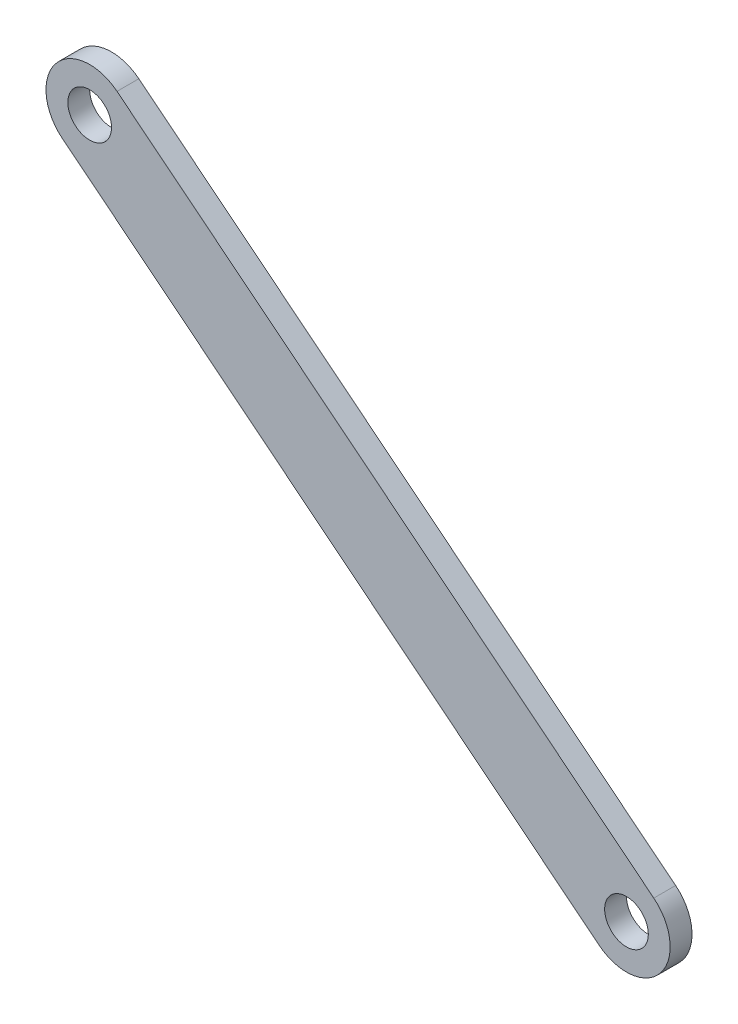
ISO-10303-21;
HEADER;
FILE_DESCRIPTION(('STEP AP214'),'2;1');
FILE_NAME('part.step','',(''),(''),'','','');
FILE_SCHEMA(('AUTOMOTIVE_DESIGN { 1 0 10303 214 1 1 1 1 }'));
ENDSEC;
DATA;
#1=APPLICATION_CONTEXT('core data for automotive mechanical design processes');
#2=APPLICATION_PROTOCOL_DEFINITION('international standard','automotive_design',2000,#1);
#3=PRODUCT_CONTEXT('',#1,'mechanical');
#4=PRODUCT('Part','Part','',(#3));
#5=PRODUCT_RELATED_PRODUCT_CATEGORY('part','',(#4));
#6=PRODUCT_DEFINITION_FORMATION('','',#4);
#7=PRODUCT_DEFINITION_CONTEXT('part definition',#1,'design');
#8=PRODUCT_DEFINITION('design','',#6,#7);
#9=PRODUCT_DEFINITION_SHAPE('','',#8);
#10=(LENGTH_UNIT() NAMED_UNIT(*) SI_UNIT(.MILLI.,.METRE.));
#11=(NAMED_UNIT(*) PLANE_ANGLE_UNIT() SI_UNIT($,.RADIAN.));
#12=(NAMED_UNIT(*) SI_UNIT($,.STERADIAN.) SOLID_ANGLE_UNIT());
#13=UNCERTAINTY_MEASURE_WITH_UNIT(LENGTH_MEASURE(1.E-05),#10,'distance_accuracy_value','');
#14=(GEOMETRIC_REPRESENTATION_CONTEXT(3) GLOBAL_UNCERTAINTY_ASSIGNED_CONTEXT((#13)) GLOBAL_UNIT_ASSIGNED_CONTEXT((#10,
#11,#12)) REPRESENTATION_CONTEXT('',''));
#15=CARTESIAN_POINT('',(0.,0.,0.));
#16=DIRECTION('',(0.,0.,1.));
#17=DIRECTION('',(1.,0.,0.));
#18=AXIS2_PLACEMENT_3D('',#15,#16,#17);
#19=CARTESIAN_POINT('',(-24.0135350971278,31.2720974548427,1.5875));
#20=DIRECTION('',(0.,0.,1.));
#21=DIRECTION('',(1.,0.,0.));
#22=AXIS2_PLACEMENT_3D('',#19,#20,#21);
#23=PLANE('',#22);
#24=CARTESIAN_POINT('',(-24.0135350971278,31.2720974548427,1.5875));
#25=DIRECTION('',(0.,0.,1.));
#26=DIRECTION('',(1.,0.,0.));
#27=AXIS2_PLACEMENT_3D('',#24,#25,#26);
#28=CIRCLE('',#27,1.5875);
#29=CARTESIAN_POINT('',(-22.4260350971278,31.2720974548427,1.5875));
#30=VERTEX_POINT('',#29);
#31=EDGE_CURVE('E101',#30,#30,#28,.T.);
#32=ORIENTED_EDGE('',*,*,#31,.F.);
#33=EDGE_LOOP('',(#32));
#34=FACE_BOUND('',#33,.T.);
#35=CARTESIAN_POINT('',(-24.0135350971278,31.2720974548427,1.5875));
#36=DIRECTION('',(0.,0.,1.));
#37=DIRECTION('',(1.,0.,0.));
#38=AXIS2_PLACEMENT_3D('',#35,#36,#37);
#39=CIRCLE('',#38,3.17500000000001);
#40=CARTESIAN_POINT('',(-22.0277569087453,33.7494569335103,1.5875));
#41=VERTEX_POINT('',#40);
#42=CARTESIAN_POINT('',(-25.9993132855103,28.794737976175,1.5875));
#43=VERTEX_POINT('',#42);
#44=EDGE_CURVE('E86',#41,#43,#39,.T.);
#45=ORIENTED_EDGE('',*,*,#44,.T.);
#46=DIRECTION('',(0.780270701942557,-0.625441949096853,0.));
#47=VECTOR('',#46,1.);
#48=CARTESIAN_POINT('',(-25.9993132855103,28.794737976175,1.5875));
#49=LINE('',#48,#47);
#50=CARTESIAN_POINT('',(13.0142218116175,-2.47735947866757,1.5875));
#51=VERTEX_POINT('',#50);
#52=EDGE_CURVE('E81',#43,#51,#49,.T.);
#53=ORIENTED_EDGE('',*,*,#52,.T.);
#54=CARTESIAN_POINT('',(15.,0.,1.5875));
#55=DIRECTION('',(0.,0.,1.));
#56=DIRECTION('',(1.,0.,0.));
#57=AXIS2_PLACEMENT_3D('',#54,#55,#56);
#58=CIRCLE('',#57,3.17500000000001);
#59=CARTESIAN_POINT('',(16.9857781883825,2.47735947866768,1.5875));
#60=VERTEX_POINT('',#59);
#61=EDGE_CURVE('E84',#51,#60,#58,.T.);
#62=ORIENTED_EDGE('',*,*,#61,.T.);
#63=DIRECTION('',(-0.780270701942557,0.625441949096853,0.));
#64=VECTOR('',#63,1.);
#65=CARTESIAN_POINT('',(-22.0277569087453,33.7494569335103,1.5875));
#66=LINE('',#65,#64);
#67=EDGE_CURVE('E51',#60,#41,#66,.T.);
#68=ORIENTED_EDGE('',*,*,#67,.T.);
#69=EDGE_LOOP('',(#45,#53,#62,#68));
#70=FACE_BOUND('',#69,.T.);
#71=CARTESIAN_POINT('',(15.,0.,1.5875));
#72=DIRECTION('',(0.,0.,1.));
#73=DIRECTION('',(1.,0.,0.));
#74=AXIS2_PLACEMENT_3D('',#71,#72,#73);
#75=CIRCLE('',#74,1.5875);
#76=CARTESIAN_POINT('',(16.5875,0.,1.5875));
#77=VERTEX_POINT('',#76);
#78=EDGE_CURVE('E116',#77,#77,#75,.T.);
#79=ORIENTED_EDGE('',*,*,#78,.F.);
#80=EDGE_LOOP('',(#79));
#81=FACE_BOUND('',#80,.T.);
#82=ADVANCED_FACE('F34',(#34,#70,#81),#23,.T.);
#83=CARTESIAN_POINT('',(-24.0135350971278,31.2720974548427,0.));
#84=DIRECTION('',(0.,0.,1.));
#85=DIRECTION('',(1.,0.,0.));
#86=AXIS2_PLACEMENT_3D('',#83,#84,#85);
#87=PLANE('',#86);
#88=CARTESIAN_POINT('',(-24.0135350971278,31.2720974548427,0.));
#89=DIRECTION('',(0.,0.,1.));
#90=DIRECTION('',(1.,0.,0.));
#91=AXIS2_PLACEMENT_3D('',#88,#89,#90);
#92=CIRCLE('',#91,1.5875);
#93=CARTESIAN_POINT('',(-22.4260350971278,31.2720974548427,0.));
#94=VERTEX_POINT('',#93);
#95=EDGE_CURVE('E113',#94,#94,#92,.T.);
#96=ORIENTED_EDGE('',*,*,#95,.T.);
#97=EDGE_LOOP('',(#96));
#98=FACE_BOUND('',#97,.T.);
#99=CARTESIAN_POINT('',(-24.0135350971278,31.2720974548427,0.));
#100=DIRECTION('',(0.,0.,1.));
#101=DIRECTION('',(1.,0.,0.));
#102=AXIS2_PLACEMENT_3D('',#99,#100,#101);
#103=CIRCLE('',#102,3.17500000000001);
#104=CARTESIAN_POINT('',(-22.0277569087453,33.7494569335103,0.));
#105=VERTEX_POINT('',#104);
#106=CARTESIAN_POINT('',(-25.9993132855103,28.794737976175,0.));
#107=VERTEX_POINT('',#106);
#108=EDGE_CURVE('E98',#105,#107,#103,.T.);
#109=ORIENTED_EDGE('',*,*,#108,.F.);
#110=DIRECTION('',(-0.780270701942557,0.625441949096853,0.));
#111=VECTOR('',#110,1.);
#112=CARTESIAN_POINT('',(-22.0277569087453,33.7494569335103,0.));
#113=LINE('',#112,#111);
#114=CARTESIAN_POINT('',(16.9857781883825,2.47735947866768,0.));
#115=VERTEX_POINT('',#114);
#116=EDGE_CURVE('E74',#115,#105,#113,.T.);
#117=ORIENTED_EDGE('',*,*,#116,.F.);
#118=CARTESIAN_POINT('',(15.,0.,0.));
#119=DIRECTION('',(0.,0.,1.));
#120=DIRECTION('',(1.,0.,0.));
#121=AXIS2_PLACEMENT_3D('',#118,#119,#120);
#122=CIRCLE('',#121,3.17500000000001);
#123=CARTESIAN_POINT('',(13.0142218116175,-2.47735947866757,0.));
#124=VERTEX_POINT('',#123);
#125=EDGE_CURVE('E68',#124,#115,#122,.T.);
#126=ORIENTED_EDGE('',*,*,#125,.F.);
#127=DIRECTION('',(0.780270701942557,-0.625441949096853,0.));
#128=VECTOR('',#127,1.);
#129=CARTESIAN_POINT('',(-25.9993132855103,28.794737976175,0.));
#130=LINE('',#129,#128);
#131=EDGE_CURVE('E90',#107,#124,#130,.T.);
#132=ORIENTED_EDGE('',*,*,#131,.F.);
#133=EDGE_LOOP('',(#109,#117,#126,#132));
#134=FACE_BOUND('',#133,.T.);
#135=CARTESIAN_POINT('',(15.,0.,0.));
#136=DIRECTION('',(0.,0.,1.));
#137=DIRECTION('',(1.,0.,0.));
#138=AXIS2_PLACEMENT_3D('',#135,#136,#137);
#139=CIRCLE('',#138,1.5875);
#140=CARTESIAN_POINT('',(16.5875,0.,0.));
#141=VERTEX_POINT('',#140);
#142=EDGE_CURVE('E119',#141,#141,#139,.T.);
#143=ORIENTED_EDGE('',*,*,#142,.T.);
#144=EDGE_LOOP('',(#143));
#145=FACE_BOUND('',#144,.T.);
#146=ADVANCED_FACE('F109',(#98,#134,#145),#87,.F.);
#147=CARTESIAN_POINT('',(-24.0135350971278,31.2720974548427,1.5875));
#148=DIRECTION('',(0.,0.,-1.));
#149=DIRECTION('',(-1.,0.,0.));
#150=AXIS2_PLACEMENT_3D('',#147,#148,#149);
#151=CYLINDRICAL_SURFACE('',#150,3.17500000000001);
#152=ORIENTED_EDGE('',*,*,#108,.T.);
#153=DIRECTION('',(0.,0.,-1.));
#154=VECTOR('',#153,1.);
#155=CARTESIAN_POINT('',(-25.9993132855103,28.794737976175,1.5875));
#156=LINE('',#155,#154);
#157=EDGE_CURVE('E11',#43,#107,#156,.T.);
#158=ORIENTED_EDGE('',*,*,#157,.F.);
#159=ORIENTED_EDGE('',*,*,#44,.F.);
#160=DIRECTION('',(0.,0.,-1.));
#161=VECTOR('',#160,1.);
#162=CARTESIAN_POINT('',(-22.0277569087453,33.7494569335103,1.5875));
#163=LINE('',#162,#161);
#164=EDGE_CURVE('E94',#41,#105,#163,.T.);
#165=ORIENTED_EDGE('',*,*,#164,.T.);
#166=EDGE_LOOP('',(#152,#158,#159,#165));
#167=FACE_BOUND('',#166,.T.);
#168=ADVANCED_FACE('F36',(#167),#151,.T.);
#169=CARTESIAN_POINT('',(-25.9993132855103,28.794737976175,1.5875));
#170=DIRECTION('',(0.625441949096853,0.780270701942557,0.));
#171=DIRECTION('',(-0.780270701942557,0.625441949096853,0.));
#172=AXIS2_PLACEMENT_3D('',#169,#170,#171);
#173=PLANE('',#172);
#174=ORIENTED_EDGE('',*,*,#131,.T.);
#175=DIRECTION('',(0.,0.,-1.));
#176=VECTOR('',#175,1.);
#177=CARTESIAN_POINT('',(13.0142218116175,-2.47735947866757,1.5875));
#178=LINE('',#177,#176);
#179=EDGE_CURVE('E43',#51,#124,#178,.T.);
#180=ORIENTED_EDGE('',*,*,#179,.F.);
#181=ORIENTED_EDGE('',*,*,#52,.F.);
#182=ORIENTED_EDGE('',*,*,#157,.T.);
#183=EDGE_LOOP('',(#174,#180,#181,#182));
#184=FACE_BOUND('',#183,.T.);
#185=ADVANCED_FACE('F89',(#184),#173,.F.);
#186=CARTESIAN_POINT('',(15.,0.,1.5875));
#187=DIRECTION('',(0.,0.,-1.));
#188=DIRECTION('',(-1.,0.,0.));
#189=AXIS2_PLACEMENT_3D('',#186,#187,#188);
#190=CYLINDRICAL_SURFACE('',#189,3.17500000000001);
#191=ORIENTED_EDGE('',*,*,#125,.T.);
#192=DIRECTION('',(0.,0.,-1.));
#193=VECTOR('',#192,1.);
#194=CARTESIAN_POINT('',(16.9857781883825,2.47735947866768,1.5875));
#195=LINE('',#194,#193);
#196=EDGE_CURVE('E91',#60,#115,#195,.T.);
#197=ORIENTED_EDGE('',*,*,#196,.F.);
#198=ORIENTED_EDGE('',*,*,#61,.F.);
#199=ORIENTED_EDGE('',*,*,#179,.T.);
#200=EDGE_LOOP('',(#191,#197,#198,#199));
#201=FACE_BOUND('',#200,.T.);
#202=ADVANCED_FACE('F92',(#201),#190,.T.);
#203=CARTESIAN_POINT('',(-22.0277569087453,33.7494569335103,1.5875));
#204=DIRECTION('',(-0.625441949096853,-0.780270701942557,0.));
#205=DIRECTION('',(0.780270701942557,-0.625441949096853,0.));
#206=AXIS2_PLACEMENT_3D('',#203,#204,#205);
#207=PLANE('',#206);
#208=ORIENTED_EDGE('',*,*,#116,.T.);
#209=ORIENTED_EDGE('',*,*,#164,.F.);
#210=ORIENTED_EDGE('',*,*,#67,.F.);
#211=ORIENTED_EDGE('',*,*,#196,.T.);
#212=EDGE_LOOP('',(#208,#209,#210,#211));
#213=FACE_BOUND('',#212,.T.);
#214=ADVANCED_FACE('F106',(#213),#207,.F.);
#215=CARTESIAN_POINT('',(-24.0135350971278,31.2720974548427,1.5875));
#216=DIRECTION('',(0.,0.,-1.));
#217=DIRECTION('',(-1.,0.,0.));
#218=AXIS2_PLACEMENT_3D('',#215,#216,#217);
#219=CYLINDRICAL_SURFACE('',#218,1.5875);
#220=ORIENTED_EDGE('',*,*,#31,.T.);
#221=EDGE_LOOP('',(#220));
#222=FACE_BOUND('',#221,.T.);
#223=ORIENTED_EDGE('',*,*,#95,.F.);
#224=EDGE_LOOP('',(#223));
#225=FACE_BOUND('',#224,.T.);
#226=ADVANCED_FACE('F137',(#222,#225),#219,.F.);
#227=CARTESIAN_POINT('',(15.,0.,1.5875));
#228=DIRECTION('',(0.,0.,-1.));
#229=DIRECTION('',(-1.,0.,0.));
#230=AXIS2_PLACEMENT_3D('',#227,#228,#229);
#231=CYLINDRICAL_SURFACE('',#230,1.5875);
#232=ORIENTED_EDGE('',*,*,#78,.T.);
#233=EDGE_LOOP('',(#232));
#234=FACE_BOUND('',#233,.T.);
#235=ORIENTED_EDGE('',*,*,#142,.F.);
#236=EDGE_LOOP('',(#235));
#237=FACE_BOUND('',#236,.T.);
#238=ADVANCED_FACE('F125',(#234,#237),#231,.F.);
#239=CLOSED_SHELL('',(#82,#146,#168,#185,#202,#214,#226,#238));
#240=MANIFOLD_SOLID_BREP('B2',#239);
#241=ADVANCED_BREP_SHAPE_REPRESENTATION('',(#18,#240),#14);
#242=SHAPE_DEFINITION_REPRESENTATION(#9,#241);
ENDSEC;
END-ISO-10303-21;
